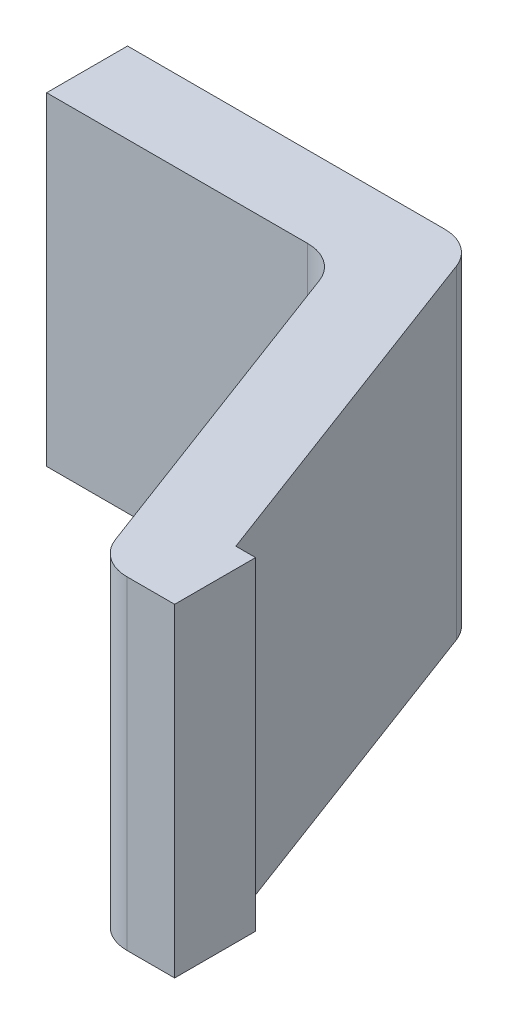
ISO-10303-21;
HEADER;
FILE_DESCRIPTION(('STEP AP214'),'2;1');
FILE_NAME('part.step','',(''),(''),'','','');
FILE_SCHEMA(('AUTOMOTIVE_DESIGN { 1 0 10303 214 1 1 1 1 }'));
ENDSEC;
DATA;
#1=APPLICATION_CONTEXT('core data for automotive mechanical design processes');
#2=APPLICATION_PROTOCOL_DEFINITION('international standard','automotive_design',2000,#1);
#3=PRODUCT_CONTEXT('',#1,'mechanical');
#4=PRODUCT('Part','Part','',(#3));
#5=PRODUCT_RELATED_PRODUCT_CATEGORY('part','',(#4));
#6=PRODUCT_DEFINITION_FORMATION('','',#4);
#7=PRODUCT_DEFINITION_CONTEXT('part definition',#1,'design');
#8=PRODUCT_DEFINITION('design','',#6,#7);
#9=PRODUCT_DEFINITION_SHAPE('','',#8);
#10=(LENGTH_UNIT() NAMED_UNIT(*) SI_UNIT(.MILLI.,.METRE.));
#11=(NAMED_UNIT(*) PLANE_ANGLE_UNIT() SI_UNIT($,.RADIAN.));
#12=(NAMED_UNIT(*) SI_UNIT($,.STERADIAN.) SOLID_ANGLE_UNIT());
#13=UNCERTAINTY_MEASURE_WITH_UNIT(LENGTH_MEASURE(1.E-05),#10,'distance_accuracy_value','');
#14=(GEOMETRIC_REPRESENTATION_CONTEXT(3) GLOBAL_UNCERTAINTY_ASSIGNED_CONTEXT((#13)) GLOBAL_UNIT_ASSIGNED_CONTEXT((#10,
#11,#12)) REPRESENTATION_CONTEXT('',''));
#15=CARTESIAN_POINT('',(0.,0.,0.));
#16=DIRECTION('',(0.,0.,1.));
#17=DIRECTION('',(1.,0.,0.));
#18=AXIS2_PLACEMENT_3D('',#15,#16,#17);
#19=CARTESIAN_POINT('',(-1.4,-1.1375,0.09375));
#20=DIRECTION('',(0.,0.,1.));
#21=DIRECTION('',(1.,0.,0.));
#22=AXIS2_PLACEMENT_3D('',#19,#20,#21);
#23=PLANE('',#22);
#24=DIRECTION('',(1.,0.,0.));
#25=VECTOR('',#24,1.);
#26=CARTESIAN_POINT('',(-1.4,-0.7625,0.09375));
#27=LINE('',#26,#25);
#28=CARTESIAN_POINT('',(-1.4,-0.7625,0.09375));
#29=VERTEX_POINT('',#28);
#30=CARTESIAN_POINT('',(-1.097453190836,-0.7625,0.09375));
#31=VERTEX_POINT('',#30);
#32=EDGE_CURVE('E11',#29,#31,#27,.T.);
#33=ORIENTED_EDGE('',*,*,#32,.F.);
#34=DIRECTION('',(0.,1.,0.));
#35=VECTOR('',#34,1.);
#36=CARTESIAN_POINT('',(-1.4,-1.1375,0.09375));
#37=LINE('',#36,#35);
#38=CARTESIAN_POINT('',(-1.4,-1.1375,0.09375));
#39=VERTEX_POINT('',#38);
#40=EDGE_CURVE('E24',#39,#29,#37,.T.);
#41=ORIENTED_EDGE('',*,*,#40,.F.);
#42=DIRECTION('',(1.,0.,0.));
#43=VECTOR('',#42,1.);
#44=CARTESIAN_POINT('',(-1.4,-1.1375,0.09375));
#45=LINE('',#44,#43);
#46=CARTESIAN_POINT('',(-1.097453190836,-1.1375,0.09375));
#47=VERTEX_POINT('',#46);
#48=EDGE_CURVE('E183',#39,#47,#45,.T.);
#49=ORIENTED_EDGE('',*,*,#48,.T.);
#50=DIRECTION('',(0.,1.,0.));
#51=VECTOR('',#50,1.);
#52=CARTESIAN_POINT('',(-1.097453190836,-1.1375,0.09375));
#53=LINE('',#52,#51);
#54=EDGE_CURVE('E181',#47,#31,#53,.T.);
#55=ORIENTED_EDGE('',*,*,#54,.T.);
#56=EDGE_LOOP('',(#33,#41,#49,#55));
#57=FACE_BOUND('',#56,.T.);
#58=ADVANCED_FACE('F17',(#57),#23,.T.);
#59=CARTESIAN_POINT('',(-1.058044595257,-0.7625,0.196898489712));
#60=DIRECTION('',(0.,1.,0.));
#61=DIRECTION('',(0.,0.,1.));
#62=AXIS2_PLACEMENT_3D('',#59,#60,#61);
#63=PLANE('',#62);
#64=DIRECTION('',(1.,0.,0.));
#65=VECTOR('',#64,1.);
#66=CARTESIAN_POINT('',(-1.4,-0.7625,0.));
#67=LINE('',#66,#65);
#68=CARTESIAN_POINT('',(-1.4,-0.7625,0.));
#69=VERTEX_POINT('',#68);
#70=CARTESIAN_POINT('',(-1.032484396945,-0.7625,0.));
#71=VERTEX_POINT('',#70);
#72=EDGE_CURVE('E179',#69,#71,#67,.T.);
#73=ORIENTED_EDGE('',*,*,#72,.F.);
#74=DIRECTION('',(0.,0.,1.));
#75=VECTOR('',#74,1.);
#76=CARTESIAN_POINT('',(-1.4,-0.7625,0.));
#77=LINE('',#76,#75);
#78=EDGE_CURVE('E177',#69,#29,#77,.T.);
#79=ORIENTED_EDGE('',*,*,#78,.T.);
#80=ORIENTED_EDGE('',*,*,#32,.T.);
#81=CARTESIAN_POINT('',(-1.097453190836,-0.7625,0.140625));
#82=DIRECTION('',(0.,-1.,0.));
#83=DIRECTION('',(0.,0.,1.));
#84=AXIS2_PLACEMENT_3D('',#81,#82,#83);
#85=CIRCLE('',#84,0.046875);
#86=CARTESIAN_POINT('',(-1.053562760637,-0.7625,0.124166088676));
#87=VERTEX_POINT('',#86);
#88=EDGE_CURVE('E175',#31,#87,#85,.T.);
#89=ORIENTED_EDGE('',*,*,#88,.T.);
#90=DIRECTION('',(0.351123441588063,0.,0.936329177569168));
#91=VECTOR('',#90,1.);
#92=CARTESIAN_POINT('',(-1.087780860397,-0.7625,0.03291782264891));
#93=LINE('',#92,#91);
#94=CARTESIAN_POINT('',(-0.91168689365,-0.7625,0.502501733973));
#95=VERTEX_POINT('',#94);
#96=EDGE_CURVE('E173',#87,#95,#93,.T.);
#97=ORIENTED_EDGE('',*,*,#96,.T.);
#98=CARTESIAN_POINT('',(-0.867796463452,-0.7625,0.486042822649));
#99=DIRECTION('',(0.,1.,0.));
#100=DIRECTION('',(0.,0.,1.));
#101=AXIS2_PLACEMENT_3D('',#98,#99,#100);
#102=CIRCLE('',#101,0.046875);
#103=CARTESIAN_POINT('',(-0.867796463452,-0.7625,0.532917822649));
#104=VERTEX_POINT('',#103);
#105=EDGE_CURVE('E119',#95,#104,#102,.T.);
#106=ORIENTED_EDGE('',*,*,#105,.T.);
#107=DIRECTION('',(1.,0.,0.));
#108=VECTOR('',#107,1.);
#109=CARTESIAN_POINT('',(-0.900280860397,-0.7625,0.532917822649));
#110=LINE('',#109,#108);
#111=CARTESIAN_POINT('',(-0.8125,-0.7625,0.532917822649));
#112=VERTEX_POINT('',#111);
#113=EDGE_CURVE('E170',#104,#112,#110,.T.);
#114=ORIENTED_EDGE('',*,*,#113,.T.);
#115=DIRECTION('',(0.,0.,1.));
#116=VECTOR('',#115,1.);
#117=CARTESIAN_POINT('',(-0.8125,-0.7625,0.439167822649));
#118=LINE('',#117,#116);
#119=CARTESIAN_POINT('',(-0.8125,-0.7625,0.439167822649));
#120=VERTEX_POINT('',#119);
#121=EDGE_CURVE('E167',#120,#112,#118,.T.);
#122=ORIENTED_EDGE('',*,*,#121,.F.);
#123=DIRECTION('',(1.,0.,0.));
#124=VECTOR('',#123,1.);
#125=CARTESIAN_POINT('',(-0.900280860397,-0.7625,0.439167822649));
#126=LINE('',#125,#124);
#127=CARTESIAN_POINT('',(-0.835312066507,-0.7625,0.439167822649));
#128=VERTEX_POINT('',#127);
#129=EDGE_CURVE('E164',#128,#120,#126,.T.);
#130=ORIENTED_EDGE('',*,*,#129,.F.);
#131=DIRECTION('',(0.351123441588063,0.,0.936329177569168));
#132=VECTOR('',#131,1.);
#133=CARTESIAN_POINT('',(-1.,-0.7625,0.));
#134=LINE('',#133,#132);
#135=CARTESIAN_POINT('',(-0.988593966747,-0.7625,0.03041608867554));
#136=VERTEX_POINT('',#135);
#137=EDGE_CURVE('E161',#136,#128,#134,.T.);
#138=ORIENTED_EDGE('',*,*,#137,.F.);
#139=CARTESIAN_POINT('',(-1.032484396945,-0.7625,0.046875));
#140=DIRECTION('',(0.,-1.,0.));
#141=DIRECTION('',(0.,0.,1.));
#142=AXIS2_PLACEMENT_3D('',#139,#140,#141);
#143=CIRCLE('',#142,0.046875);
#144=EDGE_CURVE('E158',#71,#136,#143,.T.);
#145=ORIENTED_EDGE('',*,*,#144,.F.);
#146=EDGE_LOOP('',(#73,#79,#80,#89,#97,#106,#114,#122,#130,#138,#145));
#147=FACE_BOUND('',#146,.T.);
#148=ADVANCED_FACE('F189',(#147),#63,.T.);
#149=CARTESIAN_POINT('',(-1.097453190836,-1.1375,0.140625));
#150=DIRECTION('',(0.,1.,0.));
#151=DIRECTION('',(0.,0.,-1.));
#152=AXIS2_PLACEMENT_3D('',#149,#150,#151);
#153=CYLINDRICAL_SURFACE('',#152,0.046875);
#154=CARTESIAN_POINT('',(-1.097453190836,-1.1375,0.140625));
#155=DIRECTION('',(0.,-1.,0.));
#156=DIRECTION('',(0.,0.,1.));
#157=AXIS2_PLACEMENT_3D('',#154,#155,#156);
#158=CIRCLE('',#157,0.046875);
#159=CARTESIAN_POINT('',(-1.053562760637,-1.1375,0.124166088676));
#160=VERTEX_POINT('',#159);
#161=EDGE_CURVE('E156',#47,#160,#158,.T.);
#162=ORIENTED_EDGE('',*,*,#161,.T.);
#163=DIRECTION('',(0.,1.,0.));
#164=VECTOR('',#163,1.);
#165=CARTESIAN_POINT('',(-1.053562760637,-1.1375,0.124166088676));
#166=LINE('',#165,#164);
#167=EDGE_CURVE('E113',#160,#87,#166,.T.);
#168=ORIENTED_EDGE('',*,*,#167,.T.);
#169=ORIENTED_EDGE('',*,*,#88,.F.);
#170=ORIENTED_EDGE('',*,*,#54,.F.);
#171=EDGE_LOOP('',(#162,#168,#169,#170));
#172=FACE_BOUND('',#171,.T.);
#173=ADVANCED_FACE('F216',(#172),#153,.F.);
#174=CARTESIAN_POINT('',(-1.4,-1.1375,0.));
#175=DIRECTION('',(1.,0.,0.));
#176=DIRECTION('',(0.,0.,1.));
#177=AXIS2_PLACEMENT_3D('',#174,#175,#176);
#178=PLANE('',#177);
#179=ORIENTED_EDGE('',*,*,#40,.T.);
#180=ORIENTED_EDGE('',*,*,#78,.F.);
#181=DIRECTION('',(0.,1.,0.));
#182=VECTOR('',#181,1.);
#183=CARTESIAN_POINT('',(-1.4,-1.1375,0.));
#184=LINE('',#183,#182);
#185=CARTESIAN_POINT('',(-1.4,-1.1375,0.));
#186=VERTEX_POINT('',#185);
#187=EDGE_CURVE('E152',#186,#69,#184,.T.);
#188=ORIENTED_EDGE('',*,*,#187,.F.);
#189=DIRECTION('',(0.,0.,1.));
#190=VECTOR('',#189,1.);
#191=CARTESIAN_POINT('',(-1.4,-1.1375,0.));
#192=LINE('',#191,#190);
#193=EDGE_CURVE('E149',#186,#39,#192,.T.);
#194=ORIENTED_EDGE('',*,*,#193,.T.);
#195=EDGE_LOOP('',(#179,#180,#188,#194));
#196=FACE_BOUND('',#195,.T.);
#197=ADVANCED_FACE('F186',(#196),#178,.F.);
#198=CARTESIAN_POINT('',(-1.058044595257,-1.1375,0.196898489712));
#199=DIRECTION('',(0.,-1.,0.));
#200=DIRECTION('',(0.,0.,-1.));
#201=AXIS2_PLACEMENT_3D('',#198,#199,#200);
#202=PLANE('',#201);
#203=DIRECTION('',(1.,0.,0.));
#204=VECTOR('',#203,1.);
#205=CARTESIAN_POINT('',(-1.4,-1.1375,0.));
#206=LINE('',#205,#204);
#207=CARTESIAN_POINT('',(-1.032484396945,-1.1375,0.));
#208=VERTEX_POINT('',#207);
#209=EDGE_CURVE('E147',#186,#208,#206,.T.);
#210=ORIENTED_EDGE('',*,*,#209,.T.);
#211=CARTESIAN_POINT('',(-1.032484396945,-1.1375,0.046875));
#212=DIRECTION('',(0.,-1.,0.));
#213=DIRECTION('',(0.,0.,1.));
#214=AXIS2_PLACEMENT_3D('',#211,#212,#213);
#215=CIRCLE('',#214,0.046875);
#216=CARTESIAN_POINT('',(-0.988593966747,-1.1375,0.03041608867554));
#217=VERTEX_POINT('',#216);
#218=EDGE_CURVE('E145',#208,#217,#215,.T.);
#219=ORIENTED_EDGE('',*,*,#218,.T.);
#220=DIRECTION('',(0.351123441588063,0.,0.936329177569168));
#221=VECTOR('',#220,1.);
#222=CARTESIAN_POINT('',(-1.,-1.1375,0.));
#223=LINE('',#222,#221);
#224=CARTESIAN_POINT('',(-0.835312066507,-1.1375,0.439167822649));
#225=VERTEX_POINT('',#224);
#226=EDGE_CURVE('E143',#217,#225,#223,.T.);
#227=ORIENTED_EDGE('',*,*,#226,.T.);
#228=DIRECTION('',(1.,0.,0.));
#229=VECTOR('',#228,1.);
#230=CARTESIAN_POINT('',(-0.900280860397,-1.1375,0.439167822649));
#231=LINE('',#230,#229);
#232=CARTESIAN_POINT('',(-0.8125,-1.1375,0.439167822649));
#233=VERTEX_POINT('',#232);
#234=EDGE_CURVE('E141',#225,#233,#231,.T.);
#235=ORIENTED_EDGE('',*,*,#234,.T.);
#236=DIRECTION('',(0.,0.,1.));
#237=VECTOR('',#236,1.);
#238=CARTESIAN_POINT('',(-0.8125,-1.1375,0.439167822649));
#239=LINE('',#238,#237);
#240=CARTESIAN_POINT('',(-0.8125,-1.1375,0.532917822649));
#241=VERTEX_POINT('',#240);
#242=EDGE_CURVE('E139',#233,#241,#239,.T.);
#243=ORIENTED_EDGE('',*,*,#242,.T.);
#244=DIRECTION('',(1.,0.,0.));
#245=VECTOR('',#244,1.);
#246=CARTESIAN_POINT('',(-0.900280860397,-1.1375,0.532917822649));
#247=LINE('',#246,#245);
#248=CARTESIAN_POINT('',(-0.867796463452,-1.1375,0.532917822649));
#249=VERTEX_POINT('',#248);
#250=EDGE_CURVE('E101',#249,#241,#247,.T.);
#251=ORIENTED_EDGE('',*,*,#250,.F.);
#252=CARTESIAN_POINT('',(-0.867796463452,-1.1375,0.486042822649));
#253=DIRECTION('',(0.,1.,0.));
#254=DIRECTION('',(0.,0.,1.));
#255=AXIS2_PLACEMENT_3D('',#252,#253,#254);
#256=CIRCLE('',#255,0.046875);
#257=CARTESIAN_POINT('',(-0.91168689365,-1.1375,0.502501733973));
#258=VERTEX_POINT('',#257);
#259=EDGE_CURVE('E95',#258,#249,#256,.T.);
#260=ORIENTED_EDGE('',*,*,#259,.F.);
#261=DIRECTION('',(0.351123441588063,0.,0.936329177569168));
#262=VECTOR('',#261,1.);
#263=CARTESIAN_POINT('',(-1.087780860397,-1.1375,0.03291782264891));
#264=LINE('',#263,#262);
#265=EDGE_CURVE('E99',#160,#258,#264,.T.);
#266=ORIENTED_EDGE('',*,*,#265,.F.);
#267=ORIENTED_EDGE('',*,*,#161,.F.);
#268=ORIENTED_EDGE('',*,*,#48,.F.);
#269=ORIENTED_EDGE('',*,*,#193,.F.);
#270=EDGE_LOOP('',(#210,#219,#227,#235,#243,#251,#260,#266,#267,#268,#269));
#271=FACE_BOUND('',#270,.T.);
#272=ADVANCED_FACE('F97',(#271),#202,.T.);
#273=CARTESIAN_POINT('',(-1.4,-1.1375,0.));
#274=DIRECTION('',(0.,0.,1.));
#275=DIRECTION('',(1.,0.,0.));
#276=AXIS2_PLACEMENT_3D('',#273,#274,#275);
#277=PLANE('',#276);
#278=DIRECTION('',(0.,1.,0.));
#279=VECTOR('',#278,1.);
#280=CARTESIAN_POINT('',(-1.032484396945,-1.1375,0.));
#281=LINE('',#280,#279);
#282=EDGE_CURVE('E115',#208,#71,#281,.T.);
#283=ORIENTED_EDGE('',*,*,#282,.F.);
#284=ORIENTED_EDGE('',*,*,#209,.F.);
#285=ORIENTED_EDGE('',*,*,#187,.T.);
#286=ORIENTED_EDGE('',*,*,#72,.T.);
#287=EDGE_LOOP('',(#283,#284,#285,#286));
#288=FACE_BOUND('',#287,.T.);
#289=ADVANCED_FACE('F193',(#288),#277,.F.);
#290=CARTESIAN_POINT('',(-1.032484396945,-1.1375,0.046875));
#291=DIRECTION('',(0.,1.,0.));
#292=DIRECTION('',(0.,0.,-1.));
#293=AXIS2_PLACEMENT_3D('',#290,#291,#292);
#294=CYLINDRICAL_SURFACE('',#293,0.046875);
#295=ORIENTED_EDGE('',*,*,#282,.T.);
#296=ORIENTED_EDGE('',*,*,#144,.T.);
#297=DIRECTION('',(0.,1.,0.));
#298=VECTOR('',#297,1.);
#299=CARTESIAN_POINT('',(-0.988593966747,-1.1375,0.03041608867554));
#300=LINE('',#299,#298);
#301=EDGE_CURVE('E133',#217,#136,#300,.T.);
#302=ORIENTED_EDGE('',*,*,#301,.F.);
#303=ORIENTED_EDGE('',*,*,#218,.F.);
#304=EDGE_LOOP('',(#295,#296,#302,#303));
#305=FACE_BOUND('',#304,.T.);
#306=ADVANCED_FACE('F199',(#305),#294,.T.);
#307=CARTESIAN_POINT('',(-1.,-1.1375,0.));
#308=DIRECTION('',(0.936329177569168,0.,-0.351123441588063));
#309=DIRECTION('',(0.351123441588063,0.,0.936329177569168));
#310=AXIS2_PLACEMENT_3D('',#307,#308,#309);
#311=PLANE('',#310);
#312=ORIENTED_EDGE('',*,*,#226,.F.);
#313=ORIENTED_EDGE('',*,*,#301,.T.);
#314=ORIENTED_EDGE('',*,*,#137,.T.);
#315=DIRECTION('',(0.,1.,0.));
#316=VECTOR('',#315,1.);
#317=CARTESIAN_POINT('',(-0.835312066507,-1.1375,0.439167822649));
#318=LINE('',#317,#316);
#319=EDGE_CURVE('E130',#225,#128,#318,.T.);
#320=ORIENTED_EDGE('',*,*,#319,.F.);
#321=EDGE_LOOP('',(#312,#313,#314,#320));
#322=FACE_BOUND('',#321,.T.);
#323=ADVANCED_FACE('F201',(#322),#311,.T.);
#324=CARTESIAN_POINT('',(-0.900280860397,-1.1375,0.439167822649));
#325=DIRECTION('',(0.,0.,1.));
#326=DIRECTION('',(1.,0.,0.));
#327=AXIS2_PLACEMENT_3D('',#324,#325,#326);
#328=PLANE('',#327);
#329=DIRECTION('',(0.,1.,0.));
#330=VECTOR('',#329,1.);
#331=CARTESIAN_POINT('',(-0.8125,-1.1375,0.439167822649));
#332=LINE('',#331,#330);
#333=EDGE_CURVE('E124',#233,#120,#332,.T.);
#334=ORIENTED_EDGE('',*,*,#333,.F.);
#335=ORIENTED_EDGE('',*,*,#234,.F.);
#336=ORIENTED_EDGE('',*,*,#319,.T.);
#337=ORIENTED_EDGE('',*,*,#129,.T.);
#338=EDGE_LOOP('',(#334,#335,#336,#337));
#339=FACE_BOUND('',#338,.T.);
#340=ADVANCED_FACE('F207',(#339),#328,.F.);
#341=CARTESIAN_POINT('',(-0.8125,-1.1375,0.439167822649));
#342=DIRECTION('',(1.,0.,0.));
#343=DIRECTION('',(0.,0.,1.));
#344=AXIS2_PLACEMENT_3D('',#341,#342,#343);
#345=PLANE('',#344);
#346=ORIENTED_EDGE('',*,*,#242,.F.);
#347=ORIENTED_EDGE('',*,*,#333,.T.);
#348=ORIENTED_EDGE('',*,*,#121,.T.);
#349=DIRECTION('',(0.,1.,0.));
#350=VECTOR('',#349,1.);
#351=CARTESIAN_POINT('',(-0.8125,-1.1375,0.532917822649));
#352=LINE('',#351,#350);
#353=EDGE_CURVE('E120',#241,#112,#352,.T.);
#354=ORIENTED_EDGE('',*,*,#353,.F.);
#355=EDGE_LOOP('',(#346,#347,#348,#354));
#356=FACE_BOUND('',#355,.T.);
#357=ADVANCED_FACE('F209',(#356),#345,.T.);
#358=CARTESIAN_POINT('',(-1.087780860397,-1.1375,0.03291782264891));
#359=DIRECTION('',(0.936329177569168,0.,-0.351123441588063));
#360=DIRECTION('',(0.351123441588063,0.,0.936329177569168));
#361=AXIS2_PLACEMENT_3D('',#358,#359,#360);
#362=PLANE('',#361);
#363=DIRECTION('',(0.,1.,0.));
#364=VECTOR('',#363,1.);
#365=CARTESIAN_POINT('',(-0.91168689365,-1.1375,0.502501733973));
#366=LINE('',#365,#364);
#367=EDGE_CURVE('E111',#258,#95,#366,.T.);
#368=ORIENTED_EDGE('',*,*,#367,.T.);
#369=ORIENTED_EDGE('',*,*,#96,.F.);
#370=ORIENTED_EDGE('',*,*,#167,.F.);
#371=ORIENTED_EDGE('',*,*,#265,.T.);
#372=EDGE_LOOP('',(#368,#369,#370,#371));
#373=FACE_BOUND('',#372,.T.);
#374=ADVANCED_FACE('F109',(#373),#362,.F.);
#375=CARTESIAN_POINT('',(-0.900280860397,-1.1375,0.532917822649));
#376=DIRECTION('',(0.,0.,1.));
#377=DIRECTION('',(1.,0.,0.));
#378=AXIS2_PLACEMENT_3D('',#375,#376,#377);
#379=PLANE('',#378);
#380=ORIENTED_EDGE('',*,*,#250,.T.);
#381=ORIENTED_EDGE('',*,*,#353,.T.);
#382=ORIENTED_EDGE('',*,*,#113,.F.);
#383=DIRECTION('',(0.,1.,0.));
#384=VECTOR('',#383,1.);
#385=CARTESIAN_POINT('',(-0.867796463452,-1.1375,0.532917822649));
#386=LINE('',#385,#384);
#387=EDGE_CURVE('E121',#249,#104,#386,.T.);
#388=ORIENTED_EDGE('',*,*,#387,.F.);
#389=EDGE_LOOP('',(#380,#381,#382,#388));
#390=FACE_BOUND('',#389,.T.);
#391=ADVANCED_FACE('F212',(#390),#379,.T.);
#392=CARTESIAN_POINT('',(-0.867796463452,-1.1375,0.486042822649));
#393=DIRECTION('',(0.,1.,0.));
#394=DIRECTION('',(-0.936329177569168,0.,0.351123441588063));
#395=AXIS2_PLACEMENT_3D('',#392,#393,#394);
#396=CYLINDRICAL_SURFACE('',#395,0.046875);
#397=ORIENTED_EDGE('',*,*,#259,.T.);
#398=ORIENTED_EDGE('',*,*,#387,.T.);
#399=ORIENTED_EDGE('',*,*,#105,.F.);
#400=ORIENTED_EDGE('',*,*,#367,.F.);
#401=EDGE_LOOP('',(#397,#398,#399,#400));
#402=FACE_BOUND('',#401,.T.);
#403=ADVANCED_FACE('F118',(#402),#396,.T.);
#404=CLOSED_SHELL('',(#58,#148,#173,#197,#272,#289,#306,#323,#340,#357,#374,#391,#403));
#405=MANIFOLD_SOLID_BREP('B1',#404);
#406=ADVANCED_BREP_SHAPE_REPRESENTATION('',(#18,#405),#14);
#407=SHAPE_DEFINITION_REPRESENTATION(#9,#406);
ENDSEC;
END-ISO-10303-21;
